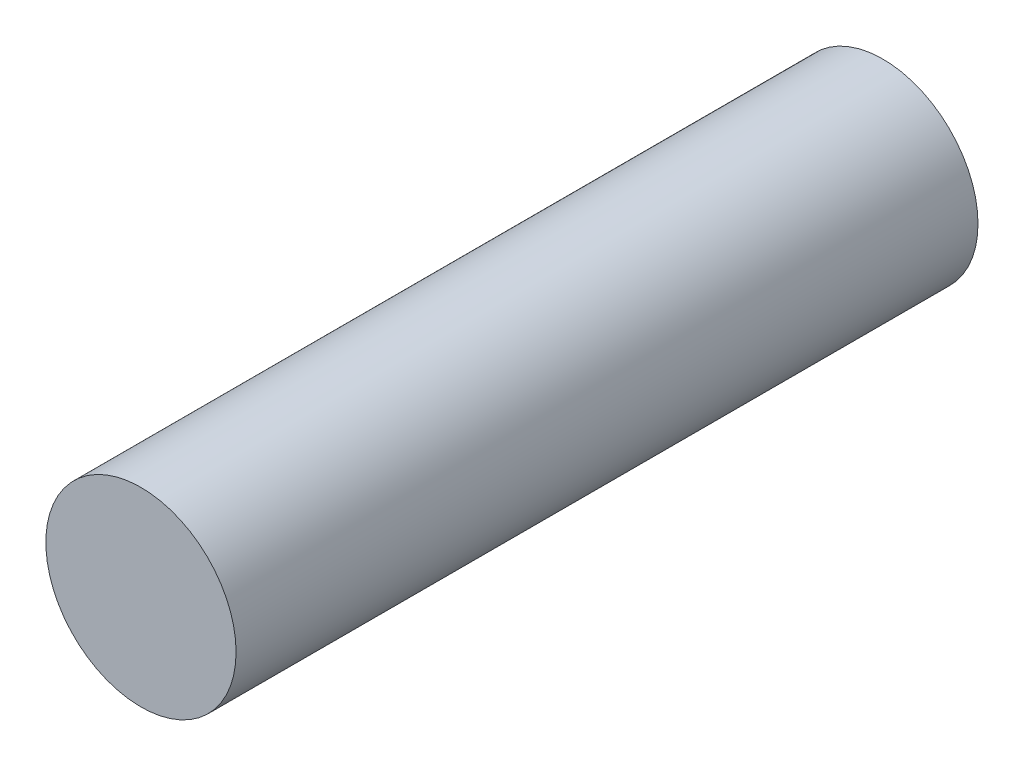
ISO-10303-21;
HEADER;
FILE_DESCRIPTION(('STEP AP214'),'2;1');
FILE_NAME('part.step','',(''),(''),'','','');
FILE_SCHEMA(('AUTOMOTIVE_DESIGN { 1 0 10303 214 1 1 1 1 }'));
ENDSEC;
DATA;
#1=APPLICATION_CONTEXT('core data for automotive mechanical design processes');
#2=APPLICATION_PROTOCOL_DEFINITION('international standard','automotive_design',2000,#1);
#3=PRODUCT_CONTEXT('',#1,'mechanical');
#4=PRODUCT('Part','Part','',(#3));
#5=PRODUCT_RELATED_PRODUCT_CATEGORY('part','',(#4));
#6=PRODUCT_DEFINITION_FORMATION('','',#4);
#7=PRODUCT_DEFINITION_CONTEXT('part definition',#1,'design');
#8=PRODUCT_DEFINITION('design','',#6,#7);
#9=PRODUCT_DEFINITION_SHAPE('','',#8);
#10=(LENGTH_UNIT() NAMED_UNIT(*) SI_UNIT(.MILLI.,.METRE.));
#11=(NAMED_UNIT(*) PLANE_ANGLE_UNIT() SI_UNIT($,.RADIAN.));
#12=(NAMED_UNIT(*) SI_UNIT($,.STERADIAN.) SOLID_ANGLE_UNIT());
#13=UNCERTAINTY_MEASURE_WITH_UNIT(LENGTH_MEASURE(1.E-05),#10,'distance_accuracy_value','');
#14=(GEOMETRIC_REPRESENTATION_CONTEXT(3) GLOBAL_UNCERTAINTY_ASSIGNED_CONTEXT((#13)) GLOBAL_UNIT_ASSIGNED_CONTEXT((#10,
#11,#12)) REPRESENTATION_CONTEXT('',''));
#15=CARTESIAN_POINT('',(0.,0.,0.));
#16=DIRECTION('',(0.,0.,1.));
#17=DIRECTION('',(1.,0.,0.));
#18=AXIS2_PLACEMENT_3D('',#15,#16,#17);
#19=CARTESIAN_POINT('',(0.,0.,19.5));
#20=DIRECTION('',(0.,0.,-1.));
#21=DIRECTION('',(-1.,0.,0.));
#22=AXIS2_PLACEMENT_3D('',#19,#20,#21);
#23=CYLINDRICAL_SURFACE('',#22,2.5);
#24=CARTESIAN_POINT('',(0.,0.,19.5));
#25=DIRECTION('',(0.,0.,1.));
#26=DIRECTION('',(1.,0.,0.));
#27=AXIS2_PLACEMENT_3D('',#24,#25,#26);
#28=CIRCLE('',#27,2.5);
#29=CARTESIAN_POINT('',(2.5,0.,19.5));
#30=VERTEX_POINT('',#29);
#31=EDGE_CURVE('E10',#30,#30,#28,.T.);
#32=ORIENTED_EDGE('',*,*,#31,.F.);
#33=EDGE_LOOP('',(#32));
#34=FACE_BOUND('',#33,.T.);
#35=CARTESIAN_POINT('',(0.,0.,0.));
#36=DIRECTION('',(0.,0.,1.));
#37=DIRECTION('',(1.,0.,0.));
#38=AXIS2_PLACEMENT_3D('',#35,#36,#37);
#39=CIRCLE('',#38,2.5);
#40=CARTESIAN_POINT('',(2.5,0.,0.));
#41=VERTEX_POINT('',#40);
#42=EDGE_CURVE('E34',#41,#41,#39,.T.);
#43=ORIENTED_EDGE('',*,*,#42,.T.);
#44=EDGE_LOOP('',(#43));
#45=FACE_BOUND('',#44,.T.);
#46=ADVANCED_FACE('F31',(#34,#45),#23,.T.);
#47=CARTESIAN_POINT('',(0.,0.,19.5));
#48=DIRECTION('',(0.,0.,1.));
#49=DIRECTION('',(1.,0.,0.));
#50=AXIS2_PLACEMENT_3D('',#47,#48,#49);
#51=PLANE('',#50);
#52=ORIENTED_EDGE('',*,*,#31,.T.);
#53=EDGE_LOOP('',(#52));
#54=FACE_BOUND('',#53,.T.);
#55=ADVANCED_FACE('F46',(#54),#51,.T.);
#56=CARTESIAN_POINT('',(0.,0.,0.));
#57=DIRECTION('',(0.,0.,1.));
#58=DIRECTION('',(1.,0.,0.));
#59=AXIS2_PLACEMENT_3D('',#56,#57,#58);
#60=PLANE('',#59);
#61=ORIENTED_EDGE('',*,*,#42,.F.);
#62=EDGE_LOOP('',(#61));
#63=FACE_BOUND('',#62,.T.);
#64=ADVANCED_FACE('F44',(#63),#60,.F.);
#65=CLOSED_SHELL('',(#46,#55,#64));
#66=MANIFOLD_SOLID_BREP('B2',#65);
#67=ADVANCED_BREP_SHAPE_REPRESENTATION('',(#18,#66),#14);
#68=SHAPE_DEFINITION_REPRESENTATION(#9,#67);
ENDSEC;
END-ISO-10303-21;
